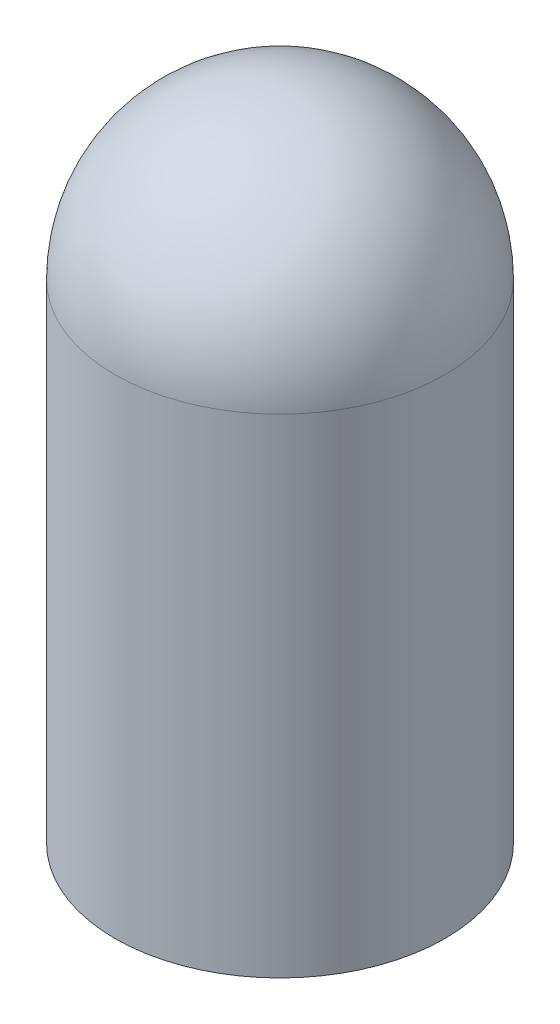
ISO-10303-21;
HEADER;
FILE_DESCRIPTION(('STEP AP214'),'2;1');
FILE_NAME('part.step','',(''),(''),'','','');
FILE_SCHEMA(('AUTOMOTIVE_DESIGN { 1 0 10303 214 1 1 1 1 }'));
ENDSEC;
DATA;
#1=APPLICATION_CONTEXT('core data for automotive mechanical design processes');
#2=APPLICATION_PROTOCOL_DEFINITION('international standard','automotive_design',2000,#1);
#3=PRODUCT_CONTEXT('',#1,'mechanical');
#4=PRODUCT('Part','Part','',(#3));
#5=PRODUCT_RELATED_PRODUCT_CATEGORY('part','',(#4));
#6=PRODUCT_DEFINITION_FORMATION('','',#4);
#7=PRODUCT_DEFINITION_CONTEXT('part definition',#1,'design');
#8=PRODUCT_DEFINITION('design','',#6,#7);
#9=PRODUCT_DEFINITION_SHAPE('','',#8);
#10=(LENGTH_UNIT() NAMED_UNIT(*) SI_UNIT(.MILLI.,.METRE.));
#11=(NAMED_UNIT(*) PLANE_ANGLE_UNIT() SI_UNIT($,.RADIAN.));
#12=(NAMED_UNIT(*) SI_UNIT($,.STERADIAN.) SOLID_ANGLE_UNIT());
#13=UNCERTAINTY_MEASURE_WITH_UNIT(LENGTH_MEASURE(1.E-05),#10,'distance_accuracy_value','');
#14=(GEOMETRIC_REPRESENTATION_CONTEXT(3) GLOBAL_UNCERTAINTY_ASSIGNED_CONTEXT((#13)) GLOBAL_UNIT_ASSIGNED_CONTEXT((#10,
#11,#12)) REPRESENTATION_CONTEXT('',''));
#15=CARTESIAN_POINT('',(0.,0.,0.));
#16=DIRECTION('',(0.,0.,1.));
#17=DIRECTION('',(1.,0.,0.));
#18=AXIS2_PLACEMENT_3D('',#15,#16,#17);
#19=CARTESIAN_POINT('',(0.,6.95,0.));
#20=DIRECTION('',(0.,-1.,0.));
#21=DIRECTION('',(0.,0.,-1.));
#22=AXIS2_PLACEMENT_3D('',#19,#20,#21);
#23=CYLINDRICAL_SURFACE('',#22,2.35);
#24=CARTESIAN_POINT('',(0.,6.95,0.));
#25=DIRECTION('',(0.,1.,0.));
#26=DIRECTION('',(0.,0.,1.));
#27=AXIS2_PLACEMENT_3D('',#24,#25,#26);
#28=CIRCLE('',#27,2.35);
#29=CARTESIAN_POINT('',(0.,6.95,2.35));
#30=VERTEX_POINT('',#29);
#31=EDGE_CURVE('E10',#30,#30,#28,.T.);
#32=ORIENTED_EDGE('',*,*,#31,.F.);
#33=EDGE_LOOP('',(#32));
#34=FACE_BOUND('',#33,.T.);
#35=CARTESIAN_POINT('',(0.,0.,0.));
#36=DIRECTION('',(0.,1.,0.));
#37=DIRECTION('',(0.,0.,1.));
#38=AXIS2_PLACEMENT_3D('',#35,#36,#37);
#39=CIRCLE('',#38,2.35);
#40=CARTESIAN_POINT('',(0.,0.,2.35));
#41=VERTEX_POINT('',#40);
#42=EDGE_CURVE('E42',#41,#41,#39,.T.);
#43=ORIENTED_EDGE('',*,*,#42,.T.);
#44=EDGE_LOOP('',(#43));
#45=FACE_BOUND('',#44,.T.);
#46=ADVANCED_FACE('F39',(#34,#45),#23,.T.);
#47=CARTESIAN_POINT('',(0.,0.,0.));
#48=DIRECTION('',(0.,1.,0.));
#49=DIRECTION('',(0.,0.,1.));
#50=AXIS2_PLACEMENT_3D('',#47,#48,#49);
#51=PLANE('',#50);
#52=ORIENTED_EDGE('',*,*,#42,.F.);
#53=EDGE_LOOP('',(#52));
#54=FACE_BOUND('',#53,.T.);
#55=ADVANCED_FACE('F52',(#54),#51,.F.);
#56=CARTESIAN_POINT('',(0.,6.95,0.));
#57=DIRECTION('',(0.,-1.,0.));
#58=DIRECTION('',(1.,0.,0.));
#59=AXIS2_PLACEMENT_3D('',#56,#57,#58);
#60=SPHERICAL_SURFACE('',#59,2.35);
#61=ORIENTED_EDGE('',*,*,#31,.T.);
#62=EDGE_LOOP('',(#61));
#63=FACE_BOUND('',#62,.T.);
#64=ADVANCED_FACE('F54',(#63),#60,.T.);
#65=CLOSED_SHELL('',(#46,#55,#64));
#66=MANIFOLD_SOLID_BREP('B2',#65);
#67=ADVANCED_BREP_SHAPE_REPRESENTATION('',(#18,#66),#14);
#68=SHAPE_DEFINITION_REPRESENTATION(#9,#67);
ENDSEC;
END-ISO-10303-21;
